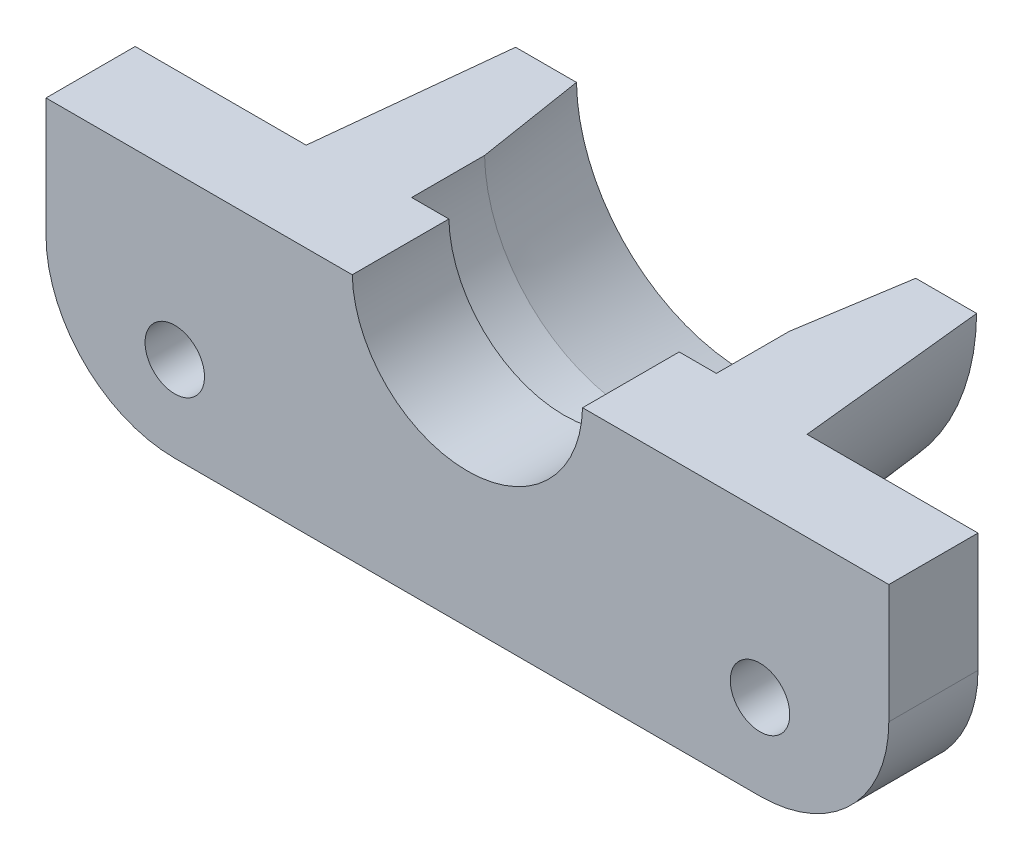
ISO-10303-21;
HEADER;
FILE_DESCRIPTION(('STEP AP214'),'2;1');
FILE_NAME('part.step','',(''),(''),'','','');
FILE_SCHEMA(('AUTOMOTIVE_DESIGN { 1 0 10303 214 1 1 1 1 }'));
ENDSEC;
DATA;
#1=APPLICATION_CONTEXT('core data for automotive mechanical design processes');
#2=APPLICATION_PROTOCOL_DEFINITION('international standard','automotive_design',2000,#1);
#3=PRODUCT_CONTEXT('',#1,'mechanical');
#4=PRODUCT('Part','Part','',(#3));
#5=PRODUCT_RELATED_PRODUCT_CATEGORY('part','',(#4));
#6=PRODUCT_DEFINITION_FORMATION('','',#4);
#7=PRODUCT_DEFINITION_CONTEXT('part definition',#1,'design');
#8=PRODUCT_DEFINITION('design','',#6,#7);
#9=PRODUCT_DEFINITION_SHAPE('','',#8);
#10=(LENGTH_UNIT() NAMED_UNIT(*) SI_UNIT(.MILLI.,.METRE.));
#11=(NAMED_UNIT(*) PLANE_ANGLE_UNIT() SI_UNIT($,.RADIAN.));
#12=(NAMED_UNIT(*) SI_UNIT($,.STERADIAN.) SOLID_ANGLE_UNIT());
#13=UNCERTAINTY_MEASURE_WITH_UNIT(LENGTH_MEASURE(1.E-05),#10,'distance_accuracy_value','');
#14=(GEOMETRIC_REPRESENTATION_CONTEXT(3) GLOBAL_UNCERTAINTY_ASSIGNED_CONTEXT((#13)) GLOBAL_UNIT_ASSIGNED_CONTEXT((#10,
#11,#12)) REPRESENTATION_CONTEXT('',''));
#15=CARTESIAN_POINT('',(0.,0.,0.));
#16=DIRECTION('',(0.,0.,1.));
#17=DIRECTION('',(1.,0.,0.));
#18=AXIS2_PLACEMENT_3D('',#15,#16,#17);
#19=CARTESIAN_POINT('',(42.7462604819422,-13.32948960946,-4.79999999999999));
#20=DIRECTION('',(0.,1.,0.));
#21=DIRECTION('',(0.,0.,1.));
#22=AXIS2_PLACEMENT_3D('',#19,#20,#21);
#23=PLANE('',#22);
#24=DIRECTION('',(0.,0.,-1.));
#25=VECTOR('',#24,1.);
#26=CARTESIAN_POINT('',(-15.7487335622286,-13.32948960946,0.));
#27=LINE('',#26,#25);
#28=CARTESIAN_POINT('',(-15.7487335622286,-13.32948960946,0.));
#29=VERTEX_POINT('',#28);
#30=CARTESIAN_POINT('',(-15.7487335622286,-13.32948960946,-4.79999999999999));
#31=VERTEX_POINT('',#30);
#32=EDGE_CURVE('E129',#29,#31,#27,.T.);
#33=ORIENTED_EDGE('',*,*,#32,.T.);
#34=DIRECTION('',(1.,0.,0.));
#35=VECTOR('',#34,1.);
#36=CARTESIAN_POINT('',(42.7462604819422,-13.32948960946,-4.79999999999999));
#37=LINE('',#36,#35);
#38=CARTESIAN_POINT('',(0.,-13.32948960946,-4.79999999999999));
#39=VERTEX_POINT('',#38);
#40=EDGE_CURVE('E277',#31,#39,#37,.T.);
#41=ORIENTED_EDGE('',*,*,#40,.T.);
#42=DIRECTION('',(-1.,0.,0.));
#43=VECTOR('',#42,1.);
#44=CARTESIAN_POINT('',(42.7462604819422,-13.32948960946,-4.79999999999999));
#45=LINE('',#44,#43);
#46=CARTESIAN_POINT('',(15.7487335622286,-13.32948960946,-4.79999999999999));
#47=VERTEX_POINT('',#46);
#48=EDGE_CURVE('E149',#47,#39,#45,.T.);
#49=ORIENTED_EDGE('',*,*,#48,.F.);
#50=DIRECTION('',(0.,0.,-1.));
#51=VECTOR('',#50,1.);
#52=CARTESIAN_POINT('',(15.7487335622286,-13.32948960946,0.));
#53=LINE('',#52,#51);
#54=CARTESIAN_POINT('',(15.7487335622286,-13.32948960946,0.));
#55=VERTEX_POINT('',#54);
#56=EDGE_CURVE('E56',#55,#47,#53,.T.);
#57=ORIENTED_EDGE('',*,*,#56,.F.);
#58=DIRECTION('',(-1.,0.,0.));
#59=VECTOR('',#58,1.);
#60=CARTESIAN_POINT('',(42.7462604819422,-13.32948960946,0.));
#61=LINE('',#60,#59);
#62=EDGE_CURVE('E143',#55,#29,#61,.T.);
#63=ORIENTED_EDGE('',*,*,#62,.T.);
#64=EDGE_LOOP('',(#33,#41,#49,#57,#63));
#65=FACE_BOUND('',#64,.T.);
#66=ADVANCED_FACE('F33',(#65),#23,.F.);
#67=CARTESIAN_POINT('',(22.67948960946,14.6587524636393,52.8266430813835));
#68=DIRECTION('',(-1.,0.,0.));
#69=DIRECTION('',(0.,-0.104528463267654,-0.994521895368274));
#70=AXIS2_PLACEMENT_3D('',#67,#68,#69);
#71=PLANE('',#70);
#72=DIRECTION('',(0.,0.,-1.));
#73=VECTOR('',#72,1.);
#74=CARTESIAN_POINT('',(22.67948960946,-6.39873356222855,0.));
#75=LINE('',#74,#73);
#76=CARTESIAN_POINT('',(22.67948960946,-6.39873356222855,0.));
#77=VERTEX_POINT('',#76);
#78=CARTESIAN_POINT('',(22.67948960946,-6.39873356222854,-4.79999999999999));
#79=VERTEX_POINT('',#78);
#80=EDGE_CURVE('E418',#77,#79,#75,.T.);
#81=ORIENTED_EDGE('',*,*,#80,.T.);
#82=DIRECTION('',(0.,1.,0.));
#83=VECTOR('',#82,1.);
#84=CARTESIAN_POINT('',(22.67948960946,14.6587524636393,-4.79999999999998));
#85=LINE('',#84,#83);
#86=CARTESIAN_POINT('',(22.67948960946,0.,-4.79999999999999));
#87=VERTEX_POINT('',#86);
#88=EDGE_CURVE('E281',#79,#87,#85,.T.);
#89=ORIENTED_EDGE('',*,*,#88,.T.);
#90=DIRECTION('',(0.,0.,-1.));
#91=VECTOR('',#90,1.);
#92=CARTESIAN_POINT('',(22.67948960946,0.,0.));
#93=LINE('',#92,#91);
#94=CARTESIAN_POINT('',(22.67948960946,0.,0.));
#95=VERTEX_POINT('',#94);
#96=EDGE_CURVE('E165',#95,#87,#93,.T.);
#97=ORIENTED_EDGE('',*,*,#96,.F.);
#98=DIRECTION('',(0.,1.,0.));
#99=VECTOR('',#98,1.);
#100=CARTESIAN_POINT('',(22.67948960946,0.,0.));
#101=LINE('',#100,#99);
#102=EDGE_CURVE('E161',#77,#95,#101,.T.);
#103=ORIENTED_EDGE('',*,*,#102,.F.);
#104=EDGE_LOOP('',(#81,#89,#97,#103));
#105=FACE_BOUND('',#104,.T.);
#106=ADVANCED_FACE('F243',(#105),#71,.F.);
#107=CARTESIAN_POINT('',(42.7462604819422,0.,0.));
#108=DIRECTION('',(0.,0.,-1.));
#109=DIRECTION('',(-1.,0.,0.));
#110=AXIS2_PLACEMENT_3D('',#107,#108,#109);
#111=PLANE('',#110);
#112=CARTESIAN_POINT('',(-15.7487335622286,-8.72948960946,0.));
#113=DIRECTION('',(0.,0.,-1.));
#114=DIRECTION('',(0.,-1.,0.));
#115=AXIS2_PLACEMENT_3D('',#112,#113,#114);
#116=CIRCLE('',#115,1.6);
#117=CARTESIAN_POINT('',(-15.7487335622286,-10.32948960946,0.));
#118=VERTEX_POINT('',#117);
#119=EDGE_CURVE('E257',#118,#118,#116,.T.);
#120=ORIENTED_EDGE('',*,*,#119,.T.);
#121=EDGE_LOOP('',(#120));
#122=FACE_BOUND('',#121,.T.);
#123=CARTESIAN_POINT('',(15.7487335622286,-8.72948960946,0.));
#124=DIRECTION('',(0.,0.,-1.));
#125=DIRECTION('',(0.,1.,0.));
#126=AXIS2_PLACEMENT_3D('',#123,#124,#125);
#127=CIRCLE('',#126,1.6);
#128=CARTESIAN_POINT('',(15.7487335622286,-7.12948960945999,0.));
#129=VERTEX_POINT('',#128);
#130=EDGE_CURVE('E260',#129,#129,#127,.T.);
#131=ORIENTED_EDGE('',*,*,#130,.T.);
#132=EDGE_LOOP('',(#131));
#133=FACE_BOUND('',#132,.T.);
#134=DIRECTION('',(0.,1.,0.));
#135=VECTOR('',#134,1.);
#136=CARTESIAN_POINT('',(-22.67948960946,0.,0.));
#137=LINE('',#136,#135);
#138=CARTESIAN_POINT('',(-22.67948960946,-6.39873356222855,0.));
#139=VERTEX_POINT('',#138);
#140=CARTESIAN_POINT('',(-22.67948960946,0.,0.));
#141=VERTEX_POINT('',#140);
#142=EDGE_CURVE('E145',#139,#141,#137,.T.);
#143=ORIENTED_EDGE('',*,*,#142,.F.);
#144=CARTESIAN_POINT('',(-15.7487335622286,-6.39873356222855,0.));
#145=DIRECTION('',(0.,0.,1.));
#146=DIRECTION('',(0.,-1.,0.));
#147=AXIS2_PLACEMENT_3D('',#144,#145,#146);
#148=CIRCLE('',#147,6.93075604723145);
#149=EDGE_CURVE('E132',#139,#29,#148,.T.);
#150=ORIENTED_EDGE('',*,*,#149,.T.);
#151=ORIENTED_EDGE('',*,*,#62,.F.);
#152=CARTESIAN_POINT('',(15.7487335622286,-6.39873356222855,0.));
#153=DIRECTION('',(0.,0.,1.));
#154=DIRECTION('',(0.,1.,0.));
#155=AXIS2_PLACEMENT_3D('',#152,#153,#154);
#156=CIRCLE('',#155,6.93075604723145);
#157=EDGE_CURVE('E421',#55,#77,#156,.T.);
#158=ORIENTED_EDGE('',*,*,#157,.T.);
#159=ORIENTED_EDGE('',*,*,#102,.T.);
#160=DIRECTION('',(-1.,0.,0.));
#161=VECTOR('',#160,1.);
#162=CARTESIAN_POINT('',(42.7462604819422,0.,0.));
#163=LINE('',#162,#161);
#164=CARTESIAN_POINT('',(6.19818521827155,0.,0.));
#165=VERTEX_POINT('',#164);
#166=EDGE_CURVE('E151',#95,#165,#163,.T.);
#167=ORIENTED_EDGE('',*,*,#166,.T.);
#168=CARTESIAN_POINT('',(0.,0.149999999999997,0.));
#169=DIRECTION('',(0.,0.,-1.));
#170=DIRECTION('',(0.,1.,0.));
#171=AXIS2_PLACEMENT_3D('',#168,#169,#170);
#172=CIRCLE('',#171,6.2);
#173=CARTESIAN_POINT('',(-6.19818521827155,0.,0.));
#174=VERTEX_POINT('',#173);
#175=EDGE_CURVE('E190',#165,#174,#172,.T.);
#176=ORIENTED_EDGE('',*,*,#175,.T.);
#177=EDGE_CURVE('E148',#174,#141,#163,.T.);
#178=ORIENTED_EDGE('',*,*,#177,.T.);
#179=EDGE_LOOP('',(#143,#150,#151,#158,#159,#167,#176,#178));
#180=FACE_BOUND('',#179,.T.);
#181=ADVANCED_FACE('F141',(#122,#133,#180),#111,.F.);
#182=CARTESIAN_POINT('',(42.7462604819422,0.,0.));
#183=DIRECTION('',(0.,-1.,0.));
#184=DIRECTION('',(0.,0.,-1.));
#185=AXIS2_PLACEMENT_3D('',#182,#183,#184);
#186=PLANE('',#185);
#187=CARTESIAN_POINT('',(-10.0230354213236,0.,-37.6752864027805));
#188=CARTESIAN_POINT('',(-10.6555373791335,0.,-31.6580988872451));
#189=CARTESIAN_POINT('',(-11.2880278070197,0.,-25.6409101597538));
#190=CARTESIAN_POINT('',(-12.1239760988551,0.,-17.688024258418));
#191=CARTESIAN_POINT('',(-12.3274412734097,0.,-15.7523278530117));
#192=CARTESIAN_POINT('',(-13.3668475356901,0.,-5.86374478903836));
#193=CARTESIAN_POINT('',(-14.2027770069015,0.,2.08914309056602));
#194=CARTESIAN_POINT('',(-15.0387019234056,0.,10.0420314488901));
#195=B_SPLINE_CURVE_WITH_KNOTS('',3,(#187,#188,#189,#190,#191,#192,#193,#194),.UNSPECIFIED.,.F.,
.F.,(4,2,2,4),(0.,18.1510175723625,23.9900986525007,47.9801973049698),.UNSPECIFIED.);
#196=CARTESIAN_POINT('',(-12.4065196615878,0.,-15.));
#197=VERTEX_POINT('',#196);
#198=CARTESIAN_POINT('',(-13.4786549822874,0.,-4.79999999999999));
#199=VERTEX_POINT('',#198);
#200=EDGE_CURVE('E200',#197,#199,#195,.T.);
#201=ORIENTED_EDGE('',*,*,#200,.T.);
#202=DIRECTION('',(-1.,0.,0.));
#203=VECTOR('',#202,1.);
#204=CARTESIAN_POINT('',(42.7462604819422,0.,-4.79999999999999));
#205=LINE('',#204,#203);
#206=CARTESIAN_POINT('',(-22.67948960946,0.,-4.79999999999999));
#207=VERTEX_POINT('',#206);
#208=EDGE_CURVE('E279',#199,#207,#205,.T.);
#209=ORIENTED_EDGE('',*,*,#208,.T.);
#210=DIRECTION('',(0.,0.,-1.));
#211=VECTOR('',#210,1.);
#212=CARTESIAN_POINT('',(-22.67948960946,0.,0.));
#213=LINE('',#212,#211);
#214=EDGE_CURVE('E198',#141,#207,#213,.T.);
#215=ORIENTED_EDGE('',*,*,#214,.F.);
#216=ORIENTED_EDGE('',*,*,#177,.F.);
#217=DIRECTION('',(0.,0.,-1.));
#218=VECTOR('',#217,1.);
#219=CARTESIAN_POINT('',(-6.19818521827155,0.,-15.));
#220=LINE('',#219,#218);
#221=CARTESIAN_POINT('',(-6.19818521827155,0.,-5.19999999999998));
#222=VERTEX_POINT('',#221);
#223=EDGE_CURVE('E170',#222,#174,#220,.F.);
#224=ORIENTED_EDGE('',*,*,#223,.F.);
#225=DIRECTION('',(1.,0.,0.));
#226=VECTOR('',#225,1.);
#227=CARTESIAN_POINT('',(42.7462604819422,0.,-5.19999999999999));
#228=LINE('',#227,#226);
#229=CARTESIAN_POINT('',(-8.19862793398993,0.,-5.19999999999999));
#230=VERTEX_POINT('',#229);
#231=EDGE_CURVE('E168',#230,#222,#228,.T.);
#232=ORIENTED_EDGE('',*,*,#231,.F.);
#233=DIRECTION('',(0.,0.,-1.));
#234=VECTOR('',#233,1.);
#235=CARTESIAN_POINT('',(-8.19862793398993,0.,-15.));
#236=LINE('',#235,#234);
#237=CARTESIAN_POINT('',(-8.19862793398993,0.,-9.12102084705312));
#238=VERTEX_POINT('',#237);
#239=EDGE_CURVE('E41',#238,#230,#236,.F.);
#240=ORIENTED_EDGE('',*,*,#239,.F.);
#241=CARTESIAN_POINT('',(-10.9524980103743,0.,-26.5060942766543));
#242=CARTESIAN_POINT('',(-10.1749707394833,0.,-21.5973481929317));
#243=CARTESIAN_POINT('',(-9.39740993995493,0.,-16.688607420491));
#244=CARTESIAN_POINT('',(-7.84222128360354,0.,-6.87113649804988));
#245=CARTESIAN_POINT('',(-7.06459342678058,0.,-1.96240634804933));
#246=CARTESIAN_POINT('',(-6.28693204132017,0.,2.94631849066923));
#247=B_SPLINE_CURVE_WITH_KNOTS('',3,(#241,#242,#243,#244,#245,#246),.UNSPECIFIED.,.F.,.F.,(4,2,
4),(0.,14.9098300094889,29.8196600193544),.UNSPECIFIED.);
#248=CARTESIAN_POINT('',(-9.12990669183391,0.,-15.));
#249=VERTEX_POINT('',#248);
#250=EDGE_CURVE('E222',#249,#238,#247,.T.);
#251=ORIENTED_EDGE('',*,*,#250,.F.);
#252=DIRECTION('',(-1.,0.,0.));
#253=VECTOR('',#252,1.);
#254=CARTESIAN_POINT('',(42.7462604819422,0.,-15.));
#255=LINE('',#254,#253);
#256=EDGE_CURVE('E158',#249,#197,#255,.T.);
#257=ORIENTED_EDGE('',*,*,#256,.T.);
#258=EDGE_LOOP('',(#201,#209,#215,#216,#224,#232,#240,#251,#257));
#259=FACE_BOUND('',#258,.T.);
#260=ADVANCED_FACE('F194',(#259),#186,.F.);
#261=ORIENTED_EDGE('',*,*,#96,.T.);
#262=DIRECTION('',(-1.,0.,0.));
#263=VECTOR('',#262,1.);
#264=CARTESIAN_POINT('',(42.7462604819422,0.,-4.79999999999999));
#265=LINE('',#264,#263);
#266=CARTESIAN_POINT('',(13.4786549822874,0.,-4.79999999999999));
#267=VERTEX_POINT('',#266);
#268=EDGE_CURVE('E283',#87,#267,#265,.T.);
#269=ORIENTED_EDGE('',*,*,#268,.T.);
#270=CARTESIAN_POINT('',(15.0387019234056,0.,10.0420314488901));
#271=CARTESIAN_POINT('',(14.2027822024488,0.,2.08914254442835));
#272=CARTESIAN_POINT('',(13.3668501334638,0.,-5.8637450621065));
#273=CARTESIAN_POINT('',(11.6949612994364,0.,-21.76951767933));
#274=CARTESIAN_POINT('',(10.8590045343941,0.,-29.7224026900187));
#275=CARTESIAN_POINT('',(10.0230354213236,0.,-37.6752864027805));
#276=B_SPLINE_CURVE_WITH_KNOTS('',3,(#270,#271,#272,#273,#274,#275),.UNSPECIFIED.,.F.,.F.,(4,2,
4),(0.,23.9900986524691,47.9801973049613),.UNSPECIFIED.);
#277=CARTESIAN_POINT('',(12.4065196615878,0.,-15.));
#278=VERTEX_POINT('',#277);
#279=EDGE_CURVE('E202',#267,#278,#276,.T.);
#280=ORIENTED_EDGE('',*,*,#279,.T.);
#281=CARTESIAN_POINT('',(9.12990669183391,0.,-15.));
#282=VERTEX_POINT('',#281);
#283=EDGE_CURVE('E159',#278,#282,#255,.T.);
#284=ORIENTED_EDGE('',*,*,#283,.T.);
#285=CARTESIAN_POINT('',(6.28693204132017,0.,2.94631849066923));
#286=CARTESIAN_POINT('',(6.85421546001786,0.,-0.634374064497968));
#287=CARTESIAN_POINT('',(7.42146540897372,0.,-4.21507192187892));
#288=CARTESIAN_POINT('',(8.19907023835659,0.,-9.12380571979563));
#289=CARTESIAN_POINT('',(8.40944415212851,0.,-10.451838645185));
#290=CARTESIAN_POINT('',(9.39740014928008,0.,-16.6886089715696));
#291=CARTESIAN_POINT('',(10.174951158137,0.,-21.5973512951101));
#292=CARTESIAN_POINT('',(10.9524980103743,0.,-26.5060942766543));
#293=B_SPLINE_CURVE_WITH_KNOTS('',3,(#285,#286,#287,#288,#289,#290,#291,#292),.UNSPECIFIED.,.F.,
.F.,(4,2,2,4),(0.,10.8760529077551,14.9098300099945,29.8196600194834),.UNSPECIFIED.);
#294=CARTESIAN_POINT('',(8.19862793398993,0.,-9.12102084705312));
#295=VERTEX_POINT('',#294);
#296=EDGE_CURVE('E215',#295,#282,#293,.T.);
#297=ORIENTED_EDGE('',*,*,#296,.F.);
#298=DIRECTION('',(0.,0.,-1.));
#299=VECTOR('',#298,1.);
#300=CARTESIAN_POINT('',(8.19862793398993,0.,-15.));
#301=LINE('',#300,#299);
#302=CARTESIAN_POINT('',(8.19862793398993,0.,-5.19999999999999));
#303=VERTEX_POINT('',#302);
#304=EDGE_CURVE('E167',#303,#295,#301,.T.);
#305=ORIENTED_EDGE('',*,*,#304,.F.);
#306=CARTESIAN_POINT('',(6.19818521827155,0.,-5.19999999999998));
#307=VERTEX_POINT('',#306);
#308=EDGE_CURVE('E164',#307,#303,#228,.T.);
#309=ORIENTED_EDGE('',*,*,#308,.F.);
#310=DIRECTION('',(0.,0.,-1.));
#311=VECTOR('',#310,1.);
#312=CARTESIAN_POINT('',(6.19818521827155,0.,-15.));
#313=LINE('',#312,#311);
#314=EDGE_CURVE('E162',#165,#307,#313,.T.);
#315=ORIENTED_EDGE('',*,*,#314,.F.);
#316=ORIENTED_EDGE('',*,*,#166,.F.);
#317=EDGE_LOOP('',(#261,#269,#280,#284,#297,#305,#309,#315,#316));
#318=FACE_BOUND('',#317,.T.);
#319=ADVANCED_FACE('F253',(#318),#186,.F.);
#320=CARTESIAN_POINT('',(42.7462604819422,0.,-15.));
#321=DIRECTION('',(0.,0.,1.));
#322=DIRECTION('',(0.,-1.,0.));
#323=AXIS2_PLACEMENT_3D('',#320,#321,#322);
#324=PLANE('',#323);
#325=ORIENTED_EDGE('',*,*,#283,.F.);
#326=CARTESIAN_POINT('',(0.,0.15,-15.));
#327=DIRECTION('',(0.,0.,-1.));
#328=DIRECTION('',(0.,1.,0.));
#329=AXIS2_PLACEMENT_3D('',#326,#327,#328);
#330=CIRCLE('',#329,12.4074264097501);
#331=EDGE_CURVE('E262',#278,#197,#330,.T.);
#332=ORIENTED_EDGE('',*,*,#331,.T.);
#333=ORIENTED_EDGE('',*,*,#256,.F.);
#334=CARTESIAN_POINT('',(0.,0.15,-15.));
#335=DIRECTION('',(0.,0.,-1.));
#336=DIRECTION('',(0.,1.,0.));
#337=AXIS2_PLACEMENT_3D('',#334,#335,#336);
#338=CIRCLE('',#337,9.13113882281907);
#339=EDGE_CURVE('E213',#282,#249,#338,.T.);
#340=ORIENTED_EDGE('',*,*,#339,.F.);
#341=EDGE_LOOP('',(#325,#332,#333,#340));
#342=FACE_BOUND('',#341,.T.);
#343=ADVANCED_FACE('F35',(#342),#324,.F.);
#344=CARTESIAN_POINT('',(-22.67948960946,14.6587524636393,52.8266430813835));
#345=DIRECTION('',(1.,0.,0.));
#346=DIRECTION('',(0.,0.104528463267654,0.994521895368274));
#347=AXIS2_PLACEMENT_3D('',#344,#345,#346);
#348=PLANE('',#347);
#349=DIRECTION('',(0.,-1.,0.));
#350=VECTOR('',#349,1.);
#351=CARTESIAN_POINT('',(-22.67948960946,14.6587524636393,-4.79999999999998));
#352=LINE('',#351,#350);
#353=CARTESIAN_POINT('',(-22.67948960946,-6.39873356222855,-4.79999999999999));
#354=VERTEX_POINT('',#353);
#355=EDGE_CURVE('E11',#207,#354,#352,.T.);
#356=ORIENTED_EDGE('',*,*,#355,.T.);
#357=DIRECTION('',(0.,0.,-1.));
#358=VECTOR('',#357,1.);
#359=CARTESIAN_POINT('',(-22.67948960946,-6.39873356222855,0.));
#360=LINE('',#359,#358);
#361=EDGE_CURVE('E48',#139,#354,#360,.T.);
#362=ORIENTED_EDGE('',*,*,#361,.F.);
#363=ORIENTED_EDGE('',*,*,#142,.T.);
#364=ORIENTED_EDGE('',*,*,#214,.T.);
#365=EDGE_LOOP('',(#356,#362,#363,#364));
#366=FACE_BOUND('',#365,.T.);
#367=ADVANCED_FACE('F238',(#366),#348,.F.);
#368=CARTESIAN_POINT('',(0.,0.15,-15.));
#369=DIRECTION('',(0.,0.,-1.));
#370=DIRECTION('',(0.,1.,0.));
#371=AXIS2_PLACEMENT_3D('',#368,#369,#370);
#372=CYLINDRICAL_SURFACE('',#371,8.2);
#373=ORIENTED_EDGE('',*,*,#239,.T.);
#374=CARTESIAN_POINT('',(0.,0.149999999999998,-5.19999999999999));
#375=DIRECTION('',(0.,0.,-1.));
#376=DIRECTION('',(0.,1.,0.));
#377=AXIS2_PLACEMENT_3D('',#374,#375,#376);
#378=CIRCLE('',#377,8.2);
#379=EDGE_CURVE('E183',#303,#230,#378,.T.);
#380=ORIENTED_EDGE('',*,*,#379,.F.);
#381=ORIENTED_EDGE('',*,*,#304,.T.);
#382=CARTESIAN_POINT('',(0.,0.149999999999999,-9.12102084705312));
#383=DIRECTION('',(0.,0.,-1.));
#384=DIRECTION('',(0.,1.,0.));
#385=AXIS2_PLACEMENT_3D('',#382,#383,#384);
#386=CIRCLE('',#385,8.2);
#387=EDGE_CURVE('E211',#295,#238,#386,.T.);
#388=ORIENTED_EDGE('',*,*,#387,.T.);
#389=EDGE_LOOP('',(#373,#380,#381,#388));
#390=FACE_BOUND('',#389,.T.);
#391=ADVANCED_FACE('F236',(#390),#372,.F.);
#392=CARTESIAN_POINT('',(0.,-8.05,-5.19999999999999));
#393=DIRECTION('',(0.,0.,-1.));
#394=DIRECTION('',(0.,1.,0.));
#395=AXIS2_PLACEMENT_3D('',#392,#393,#394);
#396=PLANE('',#395);
#397=ORIENTED_EDGE('',*,*,#231,.T.);
#398=CARTESIAN_POINT('',(0.,0.149999999999998,-5.19999999999998));
#399=DIRECTION('',(0.,0.,-1.));
#400=DIRECTION('',(0.,1.,0.));
#401=AXIS2_PLACEMENT_3D('',#398,#399,#400);
#402=CIRCLE('',#401,6.2);
#403=EDGE_CURVE('E181',#307,#222,#402,.T.);
#404=ORIENTED_EDGE('',*,*,#403,.F.);
#405=ORIENTED_EDGE('',*,*,#308,.T.);
#406=ORIENTED_EDGE('',*,*,#379,.T.);
#407=EDGE_LOOP('',(#397,#404,#405,#406));
#408=FACE_BOUND('',#407,.T.);
#409=ADVANCED_FACE('F180',(#408),#396,.T.);
#410=CARTESIAN_POINT('',(0.,0.15,-15.));
#411=DIRECTION('',(0.,0.,-1.));
#412=DIRECTION('',(0.,1.,0.));
#413=AXIS2_PLACEMENT_3D('',#410,#411,#412);
#414=CYLINDRICAL_SURFACE('',#413,6.2);
#415=ORIENTED_EDGE('',*,*,#223,.T.);
#416=ORIENTED_EDGE('',*,*,#175,.F.);
#417=ORIENTED_EDGE('',*,*,#314,.T.);
#418=ORIENTED_EDGE('',*,*,#403,.T.);
#419=EDGE_LOOP('',(#415,#416,#417,#418));
#420=FACE_BOUND('',#419,.T.);
#421=ADVANCED_FACE('F187',(#420),#414,.F.);
#422=CARTESIAN_POINT('',(0.,0.149999999999999,-9.12102084705312));
#423=DIRECTION('',(0.,0.,-1.));
#424=DIRECTION('',(0.,1.,0.));
#425=AXIS2_PLACEMENT_3D('',#422,#423,#424);
#426=CONICAL_SURFACE('',#425,8.2,0.157079632679483);
#427=ORIENTED_EDGE('',*,*,#250,.T.);
#428=ORIENTED_EDGE('',*,*,#387,.F.);
#429=ORIENTED_EDGE('',*,*,#296,.T.);
#430=ORIENTED_EDGE('',*,*,#339,.T.);
#431=EDGE_LOOP('',(#427,#428,#429,#430));
#432=FACE_BOUND('',#431,.T.);
#433=ADVANCED_FACE('F229',(#432),#426,.F.);
#434=CARTESIAN_POINT('',(0.,0.149999999999999,-4.79999999999999));
#435=DIRECTION('',(0.,0.,1.));
#436=DIRECTION('',(0.,-1.,0.));
#437=AXIS2_PLACEMENT_3D('',#434,#435,#436);
#438=CONICAL_SURFACE('',#437,13.47948960946,0.104719755119661);
#439=ORIENTED_EDGE('',*,*,#331,.F.);
#440=ORIENTED_EDGE('',*,*,#279,.F.);
#441=CARTESIAN_POINT('',(0.,0.149999999999999,-4.79999999999999));
#442=DIRECTION('',(0.,0.,-1.));
#443=DIRECTION('',(0.,1.,0.));
#444=AXIS2_PLACEMENT_3D('',#441,#442,#443);
#445=CIRCLE('',#444,13.47948960946);
#446=EDGE_CURVE('E274',#267,#39,#445,.T.);
#447=ORIENTED_EDGE('',*,*,#446,.T.);
#448=EDGE_CURVE('E266',#39,#199,#445,.T.);
#449=ORIENTED_EDGE('',*,*,#448,.T.);
#450=ORIENTED_EDGE('',*,*,#200,.F.);
#451=EDGE_LOOP('',(#439,#440,#447,#449,#450));
#452=FACE_BOUND('',#451,.T.);
#453=ADVANCED_FACE('F234',(#452),#438,.T.);
#454=CARTESIAN_POINT('',(0.,37.8299856469444,-4.79999999999998));
#455=DIRECTION('',(0.,0.,1.));
#456=DIRECTION('',(0.,-1.,0.));
#457=AXIS2_PLACEMENT_3D('',#454,#455,#456);
#458=PLANE('',#457);
#459=CARTESIAN_POINT('',(15.7487335622286,-8.72948960946,-4.79999999999999));
#460=DIRECTION('',(0.,0.,-1.));
#461=DIRECTION('',(0.,1.,0.));
#462=AXIS2_PLACEMENT_3D('',#459,#460,#461);
#463=CIRCLE('',#462,1.6);
#464=CARTESIAN_POINT('',(15.7487335622286,-7.12948960945999,-4.79999999999999));
#465=VERTEX_POINT('',#464);
#466=EDGE_CURVE('E263',#465,#465,#463,.T.);
#467=ORIENTED_EDGE('',*,*,#466,.F.);
#468=EDGE_LOOP('',(#467));
#469=FACE_BOUND('',#468,.T.);
#470=ORIENTED_EDGE('',*,*,#88,.F.);
#471=CARTESIAN_POINT('',(15.7487335622286,-6.39873356222854,-4.79999999999999));
#472=DIRECTION('',(0.,0.,1.));
#473=DIRECTION('',(0.,1.,0.));
#474=AXIS2_PLACEMENT_3D('',#471,#472,#473);
#475=CIRCLE('',#474,6.93075604723145);
#476=EDGE_CURVE('E416',#47,#79,#475,.T.);
#477=ORIENTED_EDGE('',*,*,#476,.F.);
#478=ORIENTED_EDGE('',*,*,#48,.T.);
#479=ORIENTED_EDGE('',*,*,#446,.F.);
#480=ORIENTED_EDGE('',*,*,#268,.F.);
#481=EDGE_LOOP('',(#470,#477,#478,#479,#480));
#482=FACE_BOUND('',#481,.T.);
#483=ADVANCED_FACE('F293',(#469,#482),#458,.F.);
#484=CARTESIAN_POINT('',(-15.7487335622286,-8.72948960946,-4.79999999999999));
#485=DIRECTION('',(0.,0.,-1.));
#486=DIRECTION('',(0.,-1.,0.));
#487=AXIS2_PLACEMENT_3D('',#484,#485,#486);
#488=CIRCLE('',#487,1.6);
#489=CARTESIAN_POINT('',(-15.7487335622286,-10.32948960946,-4.79999999999999));
#490=VERTEX_POINT('',#489);
#491=EDGE_CURVE('E271',#490,#490,#488,.T.);
#492=ORIENTED_EDGE('',*,*,#491,.F.);
#493=EDGE_LOOP('',(#492));
#494=FACE_BOUND('',#493,.T.);
#495=ORIENTED_EDGE('',*,*,#40,.F.);
#496=CARTESIAN_POINT('',(-15.7487335622286,-6.39873356222854,-4.79999999999999));
#497=DIRECTION('',(0.,0.,1.));
#498=DIRECTION('',(0.,-1.,0.));
#499=AXIS2_PLACEMENT_3D('',#496,#497,#498);
#500=CIRCLE('',#499,6.93075604723145);
#501=EDGE_CURVE('E133',#354,#31,#500,.T.);
#502=ORIENTED_EDGE('',*,*,#501,.F.);
#503=ORIENTED_EDGE('',*,*,#355,.F.);
#504=ORIENTED_EDGE('',*,*,#208,.F.);
#505=ORIENTED_EDGE('',*,*,#448,.F.);
#506=EDGE_LOOP('',(#495,#502,#503,#504,#505));
#507=FACE_BOUND('',#506,.T.);
#508=ADVANCED_FACE('F300',(#494,#507),#458,.F.);
#509=CARTESIAN_POINT('',(15.7487335622286,-8.72948960946,0.));
#510=DIRECTION('',(0.,0.,-1.));
#511=DIRECTION('',(0.,1.,0.));
#512=AXIS2_PLACEMENT_3D('',#509,#510,#511);
#513=CYLINDRICAL_SURFACE('',#512,1.6);
#514=ORIENTED_EDGE('',*,*,#130,.F.);
#515=EDGE_LOOP('',(#514));
#516=FACE_BOUND('',#515,.T.);
#517=ORIENTED_EDGE('',*,*,#466,.T.);
#518=EDGE_LOOP('',(#517));
#519=FACE_BOUND('',#518,.T.);
#520=ADVANCED_FACE('F295',(#516,#519),#513,.F.);
#521=CARTESIAN_POINT('',(-15.7487335622286,-8.72948960946,0.));
#522=DIRECTION('',(0.,0.,-1.));
#523=DIRECTION('',(0.,1.,0.));
#524=AXIS2_PLACEMENT_3D('',#521,#522,#523);
#525=CYLINDRICAL_SURFACE('',#524,1.6);
#526=ORIENTED_EDGE('',*,*,#119,.F.);
#527=EDGE_LOOP('',(#526));
#528=FACE_BOUND('',#527,.T.);
#529=ORIENTED_EDGE('',*,*,#491,.T.);
#530=EDGE_LOOP('',(#529));
#531=FACE_BOUND('',#530,.T.);
#532=ADVANCED_FACE('F388',(#528,#531),#525,.F.);
#533=CARTESIAN_POINT('',(15.7487335622286,-6.39873356222855,0.));
#534=DIRECTION('',(0.,0.,-1.));
#535=DIRECTION('',(0.,1.,0.));
#536=AXIS2_PLACEMENT_3D('',#533,#534,#535);
#537=CYLINDRICAL_SURFACE('',#536,6.93075604723145);
#538=ORIENTED_EDGE('',*,*,#476,.T.);
#539=ORIENTED_EDGE('',*,*,#80,.F.);
#540=ORIENTED_EDGE('',*,*,#157,.F.);
#541=ORIENTED_EDGE('',*,*,#56,.T.);
#542=EDGE_LOOP('',(#538,#539,#540,#541));
#543=FACE_BOUND('',#542,.T.);
#544=ADVANCED_FACE('F393',(#543),#537,.T.);
#545=CARTESIAN_POINT('',(-15.7487335622286,-6.39873356222855,0.));
#546=DIRECTION('',(0.,0.,-1.));
#547=DIRECTION('',(0.,1.,0.));
#548=AXIS2_PLACEMENT_3D('',#545,#546,#547);
#549=CYLINDRICAL_SURFACE('',#548,6.93075604723145);
#550=ORIENTED_EDGE('',*,*,#501,.T.);
#551=ORIENTED_EDGE('',*,*,#32,.F.);
#552=ORIENTED_EDGE('',*,*,#149,.F.);
#553=ORIENTED_EDGE('',*,*,#361,.T.);
#554=EDGE_LOOP('',(#550,#551,#552,#553));
#555=FACE_BOUND('',#554,.T.);
#556=ADVANCED_FACE('F131',(#555),#549,.T.);
#557=CLOSED_SHELL('',(#66,#106,#181,#260,#319,#343,#367,#391,#409,#421,#433,#453,#483,#508,#520,
#532,#544,#556));
#558=MANIFOLD_SOLID_BREP('B2',#557);
#559=ADVANCED_BREP_SHAPE_REPRESENTATION('',(#18,#558),#14);
#560=SHAPE_DEFINITION_REPRESENTATION(#9,#559);
ENDSEC;
END-ISO-10303-21;
